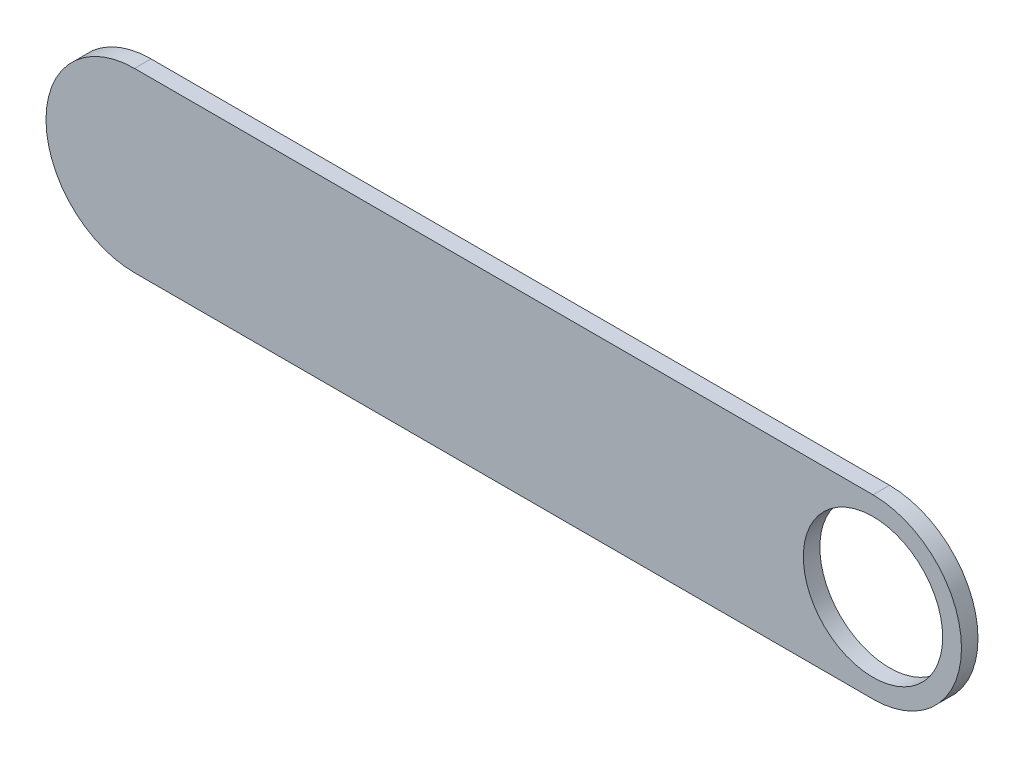
ISO-10303-21;
HEADER;
FILE_DESCRIPTION(('STEP AP214'),'2;1');
FILE_NAME('part.step','',(''),(''),'','','');
FILE_SCHEMA(('AUTOMOTIVE_DESIGN { 1 0 10303 214 1 1 1 1 }'));
ENDSEC;
DATA;
#1=APPLICATION_CONTEXT('core data for automotive mechanical design processes');
#2=APPLICATION_PROTOCOL_DEFINITION('international standard','automotive_design',2000,#1);
#3=PRODUCT_CONTEXT('',#1,'mechanical');
#4=PRODUCT('Part','Part','',(#3));
#5=PRODUCT_RELATED_PRODUCT_CATEGORY('part','',(#4));
#6=PRODUCT_DEFINITION_FORMATION('','',#4);
#7=PRODUCT_DEFINITION_CONTEXT('part definition',#1,'design');
#8=PRODUCT_DEFINITION('design','',#6,#7);
#9=PRODUCT_DEFINITION_SHAPE('','',#8);
#10=(LENGTH_UNIT() NAMED_UNIT(*) SI_UNIT(.MILLI.,.METRE.));
#11=(NAMED_UNIT(*) PLANE_ANGLE_UNIT() SI_UNIT($,.RADIAN.));
#12=(NAMED_UNIT(*) SI_UNIT($,.STERADIAN.) SOLID_ANGLE_UNIT());
#13=UNCERTAINTY_MEASURE_WITH_UNIT(LENGTH_MEASURE(1.E-05),#10,'distance_accuracy_value','');
#14=(GEOMETRIC_REPRESENTATION_CONTEXT(3) GLOBAL_UNCERTAINTY_ASSIGNED_CONTEXT((#13)) GLOBAL_UNIT_ASSIGNED_CONTEXT((#10,
#11,#12)) REPRESENTATION_CONTEXT('',''));
#15=CARTESIAN_POINT('',(0.,0.,0.));
#16=DIRECTION('',(0.,0.,1.));
#17=DIRECTION('',(1.,0.,0.));
#18=AXIS2_PLACEMENT_3D('',#15,#16,#17);
#19=CARTESIAN_POINT('',(13.65000064,12.2555,0.));
#20=DIRECTION('',(0.,1.,0.));
#21=DIRECTION('',(1.,0.,0.));
#22=AXIS2_PLACEMENT_3D('',#19,#20,#21);
#23=PLANE('',#22);
#24=DIRECTION('',(1.,0.,0.));
#25=VECTOR('',#24,1.);
#26=CARTESIAN_POINT('',(13.65000064,12.2555,0.03556));
#27=LINE('',#26,#25);
#28=CARTESIAN_POINT('',(13.65000064,12.2555,0.03556));
#29=VERTEX_POINT('',#28);
#30=CARTESIAN_POINT('',(15.24,12.2555,0.03556));
#31=VERTEX_POINT('',#30);
#32=EDGE_CURVE('E11',#29,#31,#27,.T.);
#33=ORIENTED_EDGE('',*,*,#32,.F.);
#34=DIRECTION('',(0.,0.,1.));
#35=VECTOR('',#34,1.);
#36=CARTESIAN_POINT('',(13.65000064,12.2555,0.));
#37=LINE('',#36,#35);
#38=CARTESIAN_POINT('',(13.65000064,12.2555,0.));
#39=VERTEX_POINT('',#38);
#40=EDGE_CURVE('E23',#39,#29,#37,.T.);
#41=ORIENTED_EDGE('',*,*,#40,.F.);
#42=DIRECTION('',(1.,0.,0.));
#43=VECTOR('',#42,1.);
#44=CARTESIAN_POINT('',(13.65000064,12.2555,0.));
#45=LINE('',#44,#43);
#46=CARTESIAN_POINT('',(15.24,12.2555,0.));
#47=VERTEX_POINT('',#46);
#48=EDGE_CURVE('E93',#39,#47,#45,.T.);
#49=ORIENTED_EDGE('',*,*,#48,.T.);
#50=DIRECTION('',(0.,0.,1.));
#51=VECTOR('',#50,1.);
#52=CARTESIAN_POINT('',(15.24,12.2555,0.));
#53=LINE('',#52,#51);
#54=EDGE_CURVE('E36',#47,#31,#53,.T.);
#55=ORIENTED_EDGE('',*,*,#54,.T.);
#56=EDGE_LOOP('',(#33,#41,#49,#55));
#57=FACE_BOUND('',#56,.T.);
#58=ADVANCED_FACE('F16',(#57),#23,.F.);
#59=CARTESIAN_POINT('',(13.65000064,12.446,0.));
#60=DIRECTION('',(0.,0.,-1.));
#61=DIRECTION('',(0.,1.,0.));
#62=AXIS2_PLACEMENT_3D('',#59,#60,#61);
#63=CYLINDRICAL_SURFACE('',#62,0.1905);
#64=CARTESIAN_POINT('',(13.65000064,12.446,0.03556));
#65=DIRECTION('',(0.,0.,1.));
#66=DIRECTION('',(0.,1.,0.));
#67=AXIS2_PLACEMENT_3D('',#64,#65,#66);
#68=CIRCLE('',#67,0.1905);
#69=CARTESIAN_POINT('',(13.65000064,12.6365,0.03556));
#70=VERTEX_POINT('',#69);
#71=EDGE_CURVE('E89',#70,#29,#68,.T.);
#72=ORIENTED_EDGE('',*,*,#71,.F.);
#73=DIRECTION('',(0.,0.,1.));
#74=VECTOR('',#73,1.);
#75=CARTESIAN_POINT('',(13.65000064,12.6365,0.));
#76=LINE('',#75,#74);
#77=CARTESIAN_POINT('',(13.65000064,12.6365,0.));
#78=VERTEX_POINT('',#77);
#79=EDGE_CURVE('E87',#78,#70,#76,.T.);
#80=ORIENTED_EDGE('',*,*,#79,.F.);
#81=CARTESIAN_POINT('',(13.65000064,12.446,0.));
#82=DIRECTION('',(0.,0.,1.));
#83=DIRECTION('',(0.,1.,0.));
#84=AXIS2_PLACEMENT_3D('',#81,#82,#83);
#85=CIRCLE('',#84,0.1905);
#86=EDGE_CURVE('E85',#78,#39,#85,.T.);
#87=ORIENTED_EDGE('',*,*,#86,.T.);
#88=ORIENTED_EDGE('',*,*,#40,.T.);
#89=EDGE_LOOP('',(#72,#80,#87,#88));
#90=FACE_BOUND('',#89,.T.);
#91=ADVANCED_FACE('F106',(#90),#63,.T.);
#92=CARTESIAN_POINT('',(15.24,12.446,0.));
#93=DIRECTION('',(0.,0.,-1.));
#94=DIRECTION('',(0.,-1.,0.));
#95=AXIS2_PLACEMENT_3D('',#92,#93,#94);
#96=CYLINDRICAL_SURFACE('',#95,0.1905);
#97=CARTESIAN_POINT('',(15.24,12.446,0.03556));
#98=DIRECTION('',(0.,0.,1.));
#99=DIRECTION('',(0.,-1.,0.));
#100=AXIS2_PLACEMENT_3D('',#97,#98,#99);
#101=CIRCLE('',#100,0.1905);
#102=CARTESIAN_POINT('',(15.24,12.6365,0.03556));
#103=VERTEX_POINT('',#102);
#104=EDGE_CURVE('E82',#31,#103,#101,.T.);
#105=ORIENTED_EDGE('',*,*,#104,.F.);
#106=ORIENTED_EDGE('',*,*,#54,.F.);
#107=CARTESIAN_POINT('',(15.24,12.446,0.));
#108=DIRECTION('',(0.,0.,1.));
#109=DIRECTION('',(0.,-1.,0.));
#110=AXIS2_PLACEMENT_3D('',#107,#108,#109);
#111=CIRCLE('',#110,0.1905);
#112=CARTESIAN_POINT('',(15.24,12.6365,0.));
#113=VERTEX_POINT('',#112);
#114=EDGE_CURVE('E79',#47,#113,#111,.T.);
#115=ORIENTED_EDGE('',*,*,#114,.T.);
#116=DIRECTION('',(0.,0.,1.));
#117=VECTOR('',#116,1.);
#118=CARTESIAN_POINT('',(15.24,12.6365,0.));
#119=LINE('',#118,#117);
#120=EDGE_CURVE('E77',#113,#103,#119,.T.);
#121=ORIENTED_EDGE('',*,*,#120,.T.);
#122=EDGE_LOOP('',(#105,#106,#115,#121));
#123=FACE_BOUND('',#122,.T.);
#124=ADVANCED_FACE('F101',(#123),#96,.T.);
#125=CARTESIAN_POINT('',(15.24,12.6365,0.));
#126=DIRECTION('',(0.,-1.,0.));
#127=DIRECTION('',(-1.,0.,0.));
#128=AXIS2_PLACEMENT_3D('',#125,#126,#127);
#129=PLANE('',#128);
#130=DIRECTION('',(-1.,0.,0.));
#131=VECTOR('',#130,1.);
#132=CARTESIAN_POINT('',(15.24,12.6365,0.03556));
#133=LINE('',#132,#131);
#134=EDGE_CURVE('E74',#103,#70,#133,.T.);
#135=ORIENTED_EDGE('',*,*,#134,.F.);
#136=ORIENTED_EDGE('',*,*,#120,.F.);
#137=DIRECTION('',(-1.,0.,0.));
#138=VECTOR('',#137,1.);
#139=CARTESIAN_POINT('',(15.24,12.6365,0.));
#140=LINE('',#139,#138);
#141=EDGE_CURVE('E71',#113,#78,#140,.T.);
#142=ORIENTED_EDGE('',*,*,#141,.T.);
#143=ORIENTED_EDGE('',*,*,#79,.T.);
#144=EDGE_LOOP('',(#135,#136,#142,#143));
#145=FACE_BOUND('',#144,.T.);
#146=ADVANCED_FACE('F108',(#145),#129,.F.);
#147=CARTESIAN_POINT('',(15.24,12.446,0.));
#148=DIRECTION('',(0.,0.,-1.));
#149=DIRECTION('',(1.,0.,0.));
#150=AXIS2_PLACEMENT_3D('',#147,#148,#149);
#151=CYLINDRICAL_SURFACE('',#150,0.1499997);
#152=DIRECTION('',(0.,0.,1.));
#153=VECTOR('',#152,1.);
#154=CARTESIAN_POINT('',(15.3899997,12.446,0.));
#155=LINE('',#154,#153);
#156=CARTESIAN_POINT('',(15.3899997,12.446,0.));
#157=VERTEX_POINT('',#156);
#158=CARTESIAN_POINT('',(15.3899997,12.446,0.03556));
#159=VERTEX_POINT('',#158);
#160=EDGE_CURVE('E67',#157,#159,#155,.T.);
#161=ORIENTED_EDGE('',*,*,#160,.T.);
#162=CARTESIAN_POINT('',(15.24,12.446,0.03556));
#163=DIRECTION('',(0.,0.,1.));
#164=DIRECTION('',(1.,0.,0.));
#165=AXIS2_PLACEMENT_3D('',#162,#163,#164);
#166=CIRCLE('',#165,0.1499997);
#167=EDGE_CURVE('E64',#159,#159,#166,.T.);
#168=ORIENTED_EDGE('',*,*,#167,.T.);
#169=ORIENTED_EDGE('',*,*,#160,.F.);
#170=CARTESIAN_POINT('',(15.24,12.446,0.));
#171=DIRECTION('',(0.,0.,1.));
#172=DIRECTION('',(1.,0.,0.));
#173=AXIS2_PLACEMENT_3D('',#170,#171,#172);
#174=CIRCLE('',#173,0.1499997);
#175=EDGE_CURVE('E60',#157,#157,#174,.T.);
#176=ORIENTED_EDGE('',*,*,#175,.F.);
#177=EDGE_LOOP('',(#161,#168,#169,#176));
#178=FACE_BOUND('',#177,.T.);
#179=ADVANCED_FACE('F110',(#178),#151,.F.);
#180=CARTESIAN_POINT('',(14.44500032,12.446,0.));
#181=DIRECTION('',(0.,0.,1.));
#182=DIRECTION('',(1.,0.,0.));
#183=AXIS2_PLACEMENT_3D('',#180,#181,#182);
#184=PLANE('',#183);
#185=ORIENTED_EDGE('',*,*,#141,.F.);
#186=ORIENTED_EDGE('',*,*,#114,.F.);
#187=ORIENTED_EDGE('',*,*,#48,.F.);
#188=ORIENTED_EDGE('',*,*,#86,.F.);
#189=EDGE_LOOP('',(#185,#186,#187,#188));
#190=FACE_BOUND('',#189,.T.);
#191=ORIENTED_EDGE('',*,*,#175,.T.);
#192=EDGE_LOOP('',(#191));
#193=FACE_BOUND('',#192,.T.);
#194=ADVANCED_FACE('F61',(#190,#193),#184,.F.);
#195=CARTESIAN_POINT('',(14.44500032,12.446,0.03556));
#196=DIRECTION('',(0.,0.,1.));
#197=DIRECTION('',(1.,0.,0.));
#198=AXIS2_PLACEMENT_3D('',#195,#196,#197);
#199=PLANE('',#198);
#200=ORIENTED_EDGE('',*,*,#32,.T.);
#201=ORIENTED_EDGE('',*,*,#104,.T.);
#202=ORIENTED_EDGE('',*,*,#134,.T.);
#203=ORIENTED_EDGE('',*,*,#71,.T.);
#204=EDGE_LOOP('',(#200,#201,#202,#203));
#205=FACE_BOUND('',#204,.T.);
#206=ORIENTED_EDGE('',*,*,#167,.F.);
#207=EDGE_LOOP('',(#206));
#208=FACE_BOUND('',#207,.T.);
#209=ADVANCED_FACE('F104',(#205,#208),#199,.T.);
#210=CLOSED_SHELL('',(#58,#91,#124,#146,#179,#194,#209));
#211=MANIFOLD_SOLID_BREP('B1',#210);
#212=ADVANCED_BREP_SHAPE_REPRESENTATION('',(#18,#211),#14);
#213=SHAPE_DEFINITION_REPRESENTATION(#9,#212);
ENDSEC;
END-ISO-10303-21;
